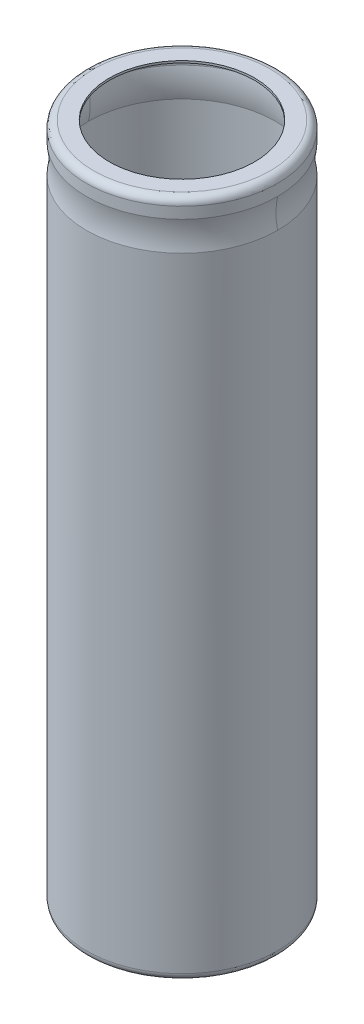
ISO-10303-21;
HEADER;
FILE_DESCRIPTION(('STEP AP214'),'2;1');
FILE_NAME('part.step','',(''),(''),'','','');
FILE_SCHEMA(('AUTOMOTIVE_DESIGN { 1 0 10303 214 1 1 1 1 }'));
ENDSEC;
DATA;
#1=APPLICATION_CONTEXT('core data for automotive mechanical design processes');
#2=APPLICATION_PROTOCOL_DEFINITION('international standard','automotive_design',2000,#1);
#3=PRODUCT_CONTEXT('',#1,'mechanical');
#4=PRODUCT('Part','Part','',(#3));
#5=PRODUCT_RELATED_PRODUCT_CATEGORY('part','',(#4));
#6=PRODUCT_DEFINITION_FORMATION('','',#4);
#7=PRODUCT_DEFINITION_CONTEXT('part definition',#1,'design');
#8=PRODUCT_DEFINITION('design','',#6,#7);
#9=PRODUCT_DEFINITION_SHAPE('','',#8);
#10=(LENGTH_UNIT() NAMED_UNIT(*) SI_UNIT(.MILLI.,.METRE.));
#11=(NAMED_UNIT(*) PLANE_ANGLE_UNIT() SI_UNIT($,.RADIAN.));
#12=(NAMED_UNIT(*) SI_UNIT($,.STERADIAN.) SOLID_ANGLE_UNIT());
#13=UNCERTAINTY_MEASURE_WITH_UNIT(LENGTH_MEASURE(1.E-05),#10,'distance_accuracy_value','');
#14=(GEOMETRIC_REPRESENTATION_CONTEXT(3) GLOBAL_UNCERTAINTY_ASSIGNED_CONTEXT((#13)) GLOBAL_UNIT_ASSIGNED_CONTEXT((#10,
#11,#12)) REPRESENTATION_CONTEXT('',''));
#15=CARTESIAN_POINT('',(0.,0.,0.));
#16=DIRECTION('',(0.,0.,1.));
#17=DIRECTION('',(1.,0.,0.));
#18=AXIS2_PLACEMENT_3D('',#15,#16,#17);
#19=CARTESIAN_POINT('',(0.,-2.74002086044368,0.));
#20=DIRECTION('',(0.,-1.,0.));
#21=DIRECTION('',(0.,0.,-1.));
#22=AXIS2_PLACEMENT_3D('',#19,#20,#21);
#23=CYLINDRICAL_SURFACE('',#22,9.);
#24=CARTESIAN_POINT('',(0.,63.4156994506804,0.));
#25=DIRECTION('',(0.,1.,0.));
#26=DIRECTION('',(0.,0.,1.));
#27=AXIS2_PLACEMENT_3D('',#24,#25,#26);
#28=CIRCLE('',#27,9.);
#29=CARTESIAN_POINT('',(-9.,63.4156994506804,0.));
#30=VERTEX_POINT('',#29);
#31=CARTESIAN_POINT('',(9.,63.4156994506804,0.));
#32=VERTEX_POINT('',#31);
#33=EDGE_CURVE('E94',#30,#32,#28,.T.);
#34=ORIENTED_EDGE('',*,*,#33,.F.);
#35=CARTESIAN_POINT('',(0.,63.4156994506804,0.));
#36=DIRECTION('',(0.,1.,0.));
#37=DIRECTION('',(0.,0.,1.));
#38=AXIS2_PLACEMENT_3D('',#35,#36,#37);
#39=CIRCLE('',#38,9.);
#40=EDGE_CURVE('E83',#32,#30,#39,.T.);
#41=ORIENTED_EDGE('',*,*,#40,.F.);
#42=EDGE_LOOP('',(#34,#41));
#43=FACE_BOUND('',#42,.T.);
#44=CARTESIAN_POINT('',(0.,64.5,0.));
#45=DIRECTION('',(0.,-1.,0.));
#46=DIRECTION('',(0.,0.,-1.));
#47=AXIS2_PLACEMENT_3D('',#44,#45,#46);
#48=CIRCLE('',#47,9.);
#49=CARTESIAN_POINT('',(0.,64.5,-9.));
#50=VERTEX_POINT('',#49);
#51=EDGE_CURVE('E111',#50,#50,#48,.F.);
#52=ORIENTED_EDGE('',*,*,#51,.T.);
#53=EDGE_LOOP('',(#52));
#54=FACE_BOUND('',#53,.T.);
#55=ADVANCED_FACE('F25',(#43,#54),#23,.F.);
#56=CARTESIAN_POINT('',(-9.,63.4156994506804,0.));
#57=CARTESIAN_POINT('',(-9.,63.4156994506804,-18.));
#58=CARTESIAN_POINT('',(8.99999999999999,63.4156994506804,-18.));
#59=CARTESIAN_POINT('',(9.,63.4156994506804,0.));
#60=CARTESIAN_POINT('',(-8.69708004539645,61.9442997310854,0.));
#61=CARTESIAN_POINT('',(-8.69708004539646,61.9442997310854,-17.3941600907929));
#62=CARTESIAN_POINT('',(8.69708004539645,61.9442997310854,-17.3941600907929));
#63=CARTESIAN_POINT('',(8.69708004539645,61.9442997310854,0.));
#64=CARTESIAN_POINT('',(-9.,60.5872723259342,0.));
#65=CARTESIAN_POINT('',(-9.,60.5872723259342,-18.));
#66=CARTESIAN_POINT('',(8.99999999999999,60.5872723259342,-18.));
#67=CARTESIAN_POINT('',(9.,60.5872723259342,0.));
#68=(BOUNDED_SURFACE() B_SPLINE_SURFACE(2,3,((#56,#57,#58,#59),(#60,#61,#62,#63),(#64,#65,#66,
#67)),.UNSPECIFIED.,.F.,.F.,.F.) B_SPLINE_SURFACE_WITH_KNOTS((3,3),(4,4),(0.,0.58752757892576),
(0.,1.),.UNSPECIFIED.) GEOMETRIC_REPRESENTATION_ITEM() RATIONAL_B_SPLINE_SURFACE(((1.,
0.333333333333333,0.333333333333333,1.),(1.,0.333333333333333,0.333333333333333,1.),(1.,
0.333333333333333,0.333333333333333,1.))) REPRESENTATION_ITEM('') SURFACE());
#69=CARTESIAN_POINT('',(9.,63.4156994506804,0.));
#70=CARTESIAN_POINT('',(8.69708004539645,61.9442997310854,0.));
#71=CARTESIAN_POINT('',(9.,60.5872723259342,0.));
#72=B_SPLINE_CURVE_WITH_KNOTS('',2,(#69,#70,#71),.UNSPECIFIED.,.F.,.F.,(3,3),(0.,
0.58752757892576),.UNSPECIFIED.);
#73=CARTESIAN_POINT('',(9.,60.5872723259342,0.));
#74=VERTEX_POINT('',#73);
#75=EDGE_CURVE('E91',#32,#74,#72,.T.);
#76=CARTESIAN_POINT('',(-9.,63.4156994506804,0.));
#77=CARTESIAN_POINT('',(-8.69708004539645,61.9442997310854,0.));
#78=CARTESIAN_POINT('',(-9.,60.5872723259342,0.));
#79=B_SPLINE_CURVE_WITH_KNOTS('',2,(#76,#77,#78),.UNSPECIFIED.,.F.,.F.,(3,3),(0.,
0.58752757892576),.UNSPECIFIED.);
#80=CARTESIAN_POINT('',(-9.,60.5872723259342,0.));
#81=VERTEX_POINT('',#80);
#82=EDGE_CURVE('E89',#81,#30,#79,.F.);
#83=CARTESIAN_POINT('',(0.,60.5872723259342,0.));
#84=DIRECTION('',(0.,-1.,0.));
#85=DIRECTION('',(0.,0.,-1.));
#86=AXIS2_PLACEMENT_3D('',#83,#84,#85);
#87=CIRCLE('',#86,9.);
#88=EDGE_CURVE('E116',#81,#74,#87,.T.);
#89=ORIENTED_EDGE('',*,*,#75,.F.);
#90=ORIENTED_EDGE('',*,*,#40,.T.);
#91=ORIENTED_EDGE('',*,*,#82,.F.);
#92=ORIENTED_EDGE('',*,*,#88,.T.);
#93=EDGE_LOOP('',(#89,#90,#91,#92));
#94=FACE_BOUND('',#93,.T.);
#95=ADVANCED_FACE('F87',(#94),#68,.T.);
#96=CARTESIAN_POINT('',(9.,63.4156994506804,0.));
#97=CARTESIAN_POINT('',(9.,63.4156994506804,18.));
#98=CARTESIAN_POINT('',(-9.,63.4156994506804,18.));
#99=CARTESIAN_POINT('',(-9.,63.4156994506804,0.));
#100=CARTESIAN_POINT('',(8.69708004539645,61.9442997310854,0.));
#101=CARTESIAN_POINT('',(8.69708004539646,61.9442997310854,17.3941600907929));
#102=CARTESIAN_POINT('',(-8.69708004539645,61.9442997310854,17.3941600907929));
#103=CARTESIAN_POINT('',(-8.69708004539645,61.9442997310854,0.));
#104=CARTESIAN_POINT('',(9.,60.5872723259342,0.));
#105=CARTESIAN_POINT('',(9.,60.5872723259342,18.));
#106=CARTESIAN_POINT('',(-9.,60.5872723259342,18.));
#107=CARTESIAN_POINT('',(-9.,60.5872723259342,0.));
#108=(BOUNDED_SURFACE() B_SPLINE_SURFACE(2,3,((#96,#97,#98,#99),(#100,#101,#102,#103),(#104,
#105,#106,#107)),.UNSPECIFIED.,.F.,.F.,.F.) B_SPLINE_SURFACE_WITH_KNOTS((3,3),(4,4),(0.,
0.58752757892576),(0.,1.),
.UNSPECIFIED.) GEOMETRIC_REPRESENTATION_ITEM() RATIONAL_B_SPLINE_SURFACE(((1.,0.333333333333333,
0.333333333333333,1.),(1.,0.333333333333333,0.333333333333333,1.),(1.,0.333333333333333,
0.333333333333333,1.))) REPRESENTATION_ITEM('') SURFACE());
#109=CARTESIAN_POINT('',(0.,60.5872723259342,0.));
#110=DIRECTION('',(0.,-1.,0.));
#111=DIRECTION('',(0.,0.,-1.));
#112=AXIS2_PLACEMENT_3D('',#109,#110,#111);
#113=CIRCLE('',#112,9.);
#114=EDGE_CURVE('E101',#74,#81,#113,.T.);
#115=ORIENTED_EDGE('',*,*,#114,.T.);
#116=ORIENTED_EDGE('',*,*,#82,.T.);
#117=ORIENTED_EDGE('',*,*,#33,.T.);
#118=ORIENTED_EDGE('',*,*,#75,.T.);
#119=EDGE_LOOP('',(#115,#116,#117,#118));
#120=FACE_BOUND('',#119,.T.);
#121=ADVANCED_FACE('F99',(#120),#108,.T.);
#122=CARTESIAN_POINT('',(0.,64.5,0.));
#123=DIRECTION('',(0.,-1.,0.));
#124=DIRECTION('',(0.,0.,-1.));
#125=AXIS2_PLACEMENT_3D('',#122,#123,#124);
#126=TOROIDAL_SURFACE('',#125,8.49851411169271,0.501485888307285);
#127=ORIENTED_EDGE('',*,*,#51,.F.);
#128=EDGE_LOOP('',(#127));
#129=FACE_BOUND('',#128,.T.);
#130=CARTESIAN_POINT('',(0.,65.0014804499123,0.));
#131=DIRECTION('',(0.,1.,0.));
#132=DIRECTION('',(0.,0.,-1.));
#133=AXIS2_PLACEMENT_3D('',#130,#131,#132);
#134=CIRCLE('',#133,8.49617861879794);
#135=CARTESIAN_POINT('',(0.,65.0014815375913,8.49617861879799));
#136=VERTEX_POINT('',#135);
#137=CARTESIAN_POINT('',(0.,65.0014815375913,-8.49617861879799));
#138=VERTEX_POINT('',#137);
#139=EDGE_CURVE('E264',#136,#138,#134,.F.);
#140=ORIENTED_EDGE('',*,*,#139,.F.);
#141=CARTESIAN_POINT('',(0.,65.0014804499123,0.));
#142=DIRECTION('',(0.,1.,0.));
#143=DIRECTION('',(0.,0.,1.));
#144=AXIS2_PLACEMENT_3D('',#141,#142,#143);
#145=CIRCLE('',#144,8.49617861879794);
#146=EDGE_CURVE('E261',#138,#136,#145,.F.);
#147=ORIENTED_EDGE('',*,*,#146,.F.);
#148=EDGE_LOOP('',(#140,#147));
#149=FACE_BOUND('',#148,.T.);
#150=ADVANCED_FACE('F263',(#129,#149),#126,.F.);
#151=CARTESIAN_POINT('',(0.,-2.74002086044368,0.));
#152=DIRECTION('',(0.,-1.,0.));
#153=DIRECTION('',(0.,0.,-1.));
#154=AXIS2_PLACEMENT_3D('',#151,#152,#153);
#155=CYLINDRICAL_SURFACE('',#154,9.);
#156=ORIENTED_EDGE('',*,*,#88,.F.);
#157=ORIENTED_EDGE('',*,*,#114,.F.);
#158=EDGE_LOOP('',(#156,#157));
#159=FACE_BOUND('',#158,.T.);
#160=CARTESIAN_POINT('',(0.,0.5,0.));
#161=DIRECTION('',(0.,-1.,0.));
#162=DIRECTION('',(0.,0.,-1.));
#163=AXIS2_PLACEMENT_3D('',#160,#161,#162);
#164=CIRCLE('',#163,9.);
#165=CARTESIAN_POINT('',(0.,0.5,-9.));
#166=VERTEX_POINT('',#165);
#167=EDGE_CURVE('E142',#166,#166,#164,.T.);
#168=ORIENTED_EDGE('',*,*,#167,.T.);
#169=EDGE_LOOP('',(#168));
#170=FACE_BOUND('',#169,.T.);
#171=ADVANCED_FACE('F289',(#159,#170),#155,.F.);
#172=CARTESIAN_POINT('',(7.,65.0014831691098,0.));
#173=DIRECTION('',(0.,-1.,0.));
#174=DIRECTION('',(0.,0.,-1.));
#175=AXIS2_PLACEMENT_3D('',#172,#173,#174);
#176=PLANE('',#175);
#177=CARTESIAN_POINT('',(0.,65.0014831691098,0.));
#178=DIRECTION('',(0.,-1.,0.));
#179=DIRECTION('',(0.,0.,-1.));
#180=AXIS2_PLACEMENT_3D('',#177,#178,#179);
#181=CIRCLE('',#180,7.);
#182=CARTESIAN_POINT('',(0.,65.0014831691098,-7.));
#183=VERTEX_POINT('',#182);
#184=EDGE_CURVE('E139',#183,#183,#181,.F.);
#185=ORIENTED_EDGE('',*,*,#184,.T.);
#186=EDGE_LOOP('',(#185));
#187=FACE_BOUND('',#186,.T.);
#188=ORIENTED_EDGE('',*,*,#146,.T.);
#189=ORIENTED_EDGE('',*,*,#139,.T.);
#190=EDGE_LOOP('',(#188,#189));
#191=FACE_BOUND('',#190,.T.);
#192=ADVANCED_FACE('F269',(#187,#191),#176,.T.);
#193=CARTESIAN_POINT('',(0.,0.5,0.));
#194=DIRECTION('',(0.,-1.,0.));
#195=DIRECTION('',(0.,0.,-1.));
#196=AXIS2_PLACEMENT_3D('',#193,#194,#195);
#197=TOROIDAL_SURFACE('',#196,8.5,0.5);
#198=ORIENTED_EDGE('',*,*,#167,.F.);
#199=EDGE_LOOP('',(#198));
#200=FACE_BOUND('',#199,.T.);
#201=CARTESIAN_POINT('',(0.,0.00916013452848495,0.));
#202=DIRECTION('',(0.,1.,0.));
#203=DIRECTION('',(0.,0.,1.));
#204=AXIS2_PLACEMENT_3D('',#201,#202,#203);
#205=CIRCLE('',#204,8.59526923146486);
#206=CARTESIAN_POINT('',(0.,0.00916013452848495,8.59526923146486));
#207=VERTEX_POINT('',#206);
#208=EDGE_CURVE('E138',#207,#207,#205,.F.);
#209=ORIENTED_EDGE('',*,*,#208,.T.);
#210=EDGE_LOOP('',(#209));
#211=FACE_BOUND('',#210,.T.);
#212=ADVANCED_FACE('F288',(#200,#211),#197,.F.);
#213=CARTESIAN_POINT('',(0.,-2.74002086044368,0.));
#214=DIRECTION('',(0.,-1.,0.));
#215=DIRECTION('',(0.,0.,-1.));
#216=AXIS2_PLACEMENT_3D('',#213,#214,#215);
#217=CYLINDRICAL_SURFACE('',#216,7.);
#218=ORIENTED_EDGE('',*,*,#184,.F.);
#219=EDGE_LOOP('',(#218));
#220=FACE_BOUND('',#219,.T.);
#221=CARTESIAN_POINT('',(0.,65.2014858883073,0.));
#222=DIRECTION('',(0.,-1.,0.));
#223=DIRECTION('',(0.,0.,-1.));
#224=AXIS2_PLACEMENT_3D('',#221,#222,#223);
#225=CIRCLE('',#224,7.);
#226=CARTESIAN_POINT('',(0.,65.2014858883073,-7.));
#227=VERTEX_POINT('',#226);
#228=EDGE_CURVE('E135',#227,#227,#225,.T.);
#229=ORIENTED_EDGE('',*,*,#228,.F.);
#230=EDGE_LOOP('',(#229));
#231=FACE_BOUND('',#230,.T.);
#232=ADVANCED_FACE('F329',(#220,#231),#217,.F.);
#233=CARTESIAN_POINT('',(0.,0.00916013452848495,0.));
#234=DIRECTION('',(0.,1.,0.));
#235=DIRECTION('',(0.,0.,1.));
#236=AXIS2_PLACEMENT_3D('',#233,#234,#235);
#237=CONICAL_SURFACE('',#236,8.59526923146486,1.47722153041464);
#238=CARTESIAN_POINT('',(0.,0.,0.));
#239=DIRECTION('',(0.,1.,0.));
#240=DIRECTION('',(0.,0.,1.));
#241=AXIS2_PLACEMENT_3D('',#238,#239,#240);
#242=CIRCLE('',#241,8.49766407343343);
#243=CARTESIAN_POINT('',(0.,0.,8.49766407343343));
#244=VERTEX_POINT('',#243);
#245=EDGE_CURVE('E131',#244,#244,#242,.T.);
#246=ORIENTED_EDGE('',*,*,#245,.F.);
#247=EDGE_LOOP('',(#246));
#248=FACE_BOUND('',#247,.T.);
#249=ORIENTED_EDGE('',*,*,#208,.F.);
#250=EDGE_LOOP('',(#249));
#251=FACE_BOUND('',#250,.T.);
#252=ADVANCED_FACE('F400',(#248,#251),#237,.F.);
#253=CARTESIAN_POINT('',(7.,65.2014858883073,0.));
#254=DIRECTION('',(0.,1.,0.));
#255=DIRECTION('',(0.,0.,1.));
#256=AXIS2_PLACEMENT_3D('',#253,#254,#255);
#257=PLANE('',#256);
#258=CARTESIAN_POINT('',(0.,65.2014858883073,0.));
#259=DIRECTION('',(0.,-1.,0.));
#260=DIRECTION('',(0.,0.,-1.));
#261=AXIS2_PLACEMENT_3D('',#258,#259,#260);
#262=CIRCLE('',#261,8.49851411169271);
#263=CARTESIAN_POINT('',(0.,65.2014858883073,-8.49851411169271));
#264=VERTEX_POINT('',#263);
#265=CARTESIAN_POINT('',(0.,65.2014858883073,8.49851411169271));
#266=VERTEX_POINT('',#265);
#267=EDGE_CURVE('E134',#264,#266,#262,.T.);
#268=ORIENTED_EDGE('',*,*,#267,.F.);
#269=CARTESIAN_POINT('',(0.,65.2014858883073,0.));
#270=DIRECTION('',(0.,-1.,0.));
#271=DIRECTION('',(0.,0.,1.));
#272=AXIS2_PLACEMENT_3D('',#269,#270,#271);
#273=CIRCLE('',#272,8.4985141116927);
#274=EDGE_CURVE('E130',#266,#264,#273,.T.);
#275=ORIENTED_EDGE('',*,*,#274,.F.);
#276=EDGE_LOOP('',(#268,#275));
#277=FACE_BOUND('',#276,.T.);
#278=ORIENTED_EDGE('',*,*,#228,.T.);
#279=EDGE_LOOP('',(#278));
#280=FACE_BOUND('',#279,.T.);
#281=ADVANCED_FACE('F393',(#277,#280),#257,.T.);
#282=CARTESIAN_POINT('',(8.49766407343343,0.,0.));
#283=DIRECTION('',(0.,1.,0.));
#284=DIRECTION('',(0.,0.,1.));
#285=AXIS2_PLACEMENT_3D('',#282,#283,#284);
#286=PLANE('',#285);
#287=ORIENTED_EDGE('',*,*,#245,.T.);
#288=EDGE_LOOP('',(#287));
#289=FACE_BOUND('',#288,.T.);
#290=CARTESIAN_POINT('',(0.,0.,0.));
#291=DIRECTION('',(0.,-1.,0.));
#292=DIRECTION('',(0.,0.,-1.));
#293=AXIS2_PLACEMENT_3D('',#290,#291,#292);
#294=CIRCLE('',#293,7.);
#295=CARTESIAN_POINT('',(0.,0.,-7.));
#296=VERTEX_POINT('',#295);
#297=EDGE_CURVE('E127',#296,#296,#294,.T.);
#298=ORIENTED_EDGE('',*,*,#297,.T.);
#299=EDGE_LOOP('',(#298));
#300=FACE_BOUND('',#299,.T.);
#301=ADVANCED_FACE('F243',(#289,#300),#286,.T.);
#302=CARTESIAN_POINT('',(0.,64.5,0.));
#303=DIRECTION('',(0.,-1.,0.));
#304=DIRECTION('',(0.,0.,-1.));
#305=AXIS2_PLACEMENT_3D('',#302,#303,#304);
#306=TOROIDAL_SURFACE('',#305,8.4985141116927,0.701485888307297);
#307=ORIENTED_EDGE('',*,*,#267,.T.);
#308=ORIENTED_EDGE('',*,*,#274,.T.);
#309=EDGE_LOOP('',(#307,#308));
#310=FACE_BOUND('',#309,.T.);
#311=CARTESIAN_POINT('',(0.,64.5,0.));
#312=DIRECTION('',(0.,-1.,0.));
#313=DIRECTION('',(0.,0.,-1.));
#314=AXIS2_PLACEMENT_3D('',#311,#312,#313);
#315=CIRCLE('',#314,9.2);
#316=CARTESIAN_POINT('',(0.,64.5,-9.2));
#317=VERTEX_POINT('',#316);
#318=EDGE_CURVE('E126',#317,#317,#315,.T.);
#319=ORIENTED_EDGE('',*,*,#318,.F.);
#320=EDGE_LOOP('',(#319));
#321=FACE_BOUND('',#320,.T.);
#322=ADVANCED_FACE('F238',(#310,#321),#306,.T.);
#323=CARTESIAN_POINT('',(0.,-2.74002086044368,0.));
#324=DIRECTION('',(0.,-1.,0.));
#325=DIRECTION('',(0.,0.,-1.));
#326=AXIS2_PLACEMENT_3D('',#323,#324,#325);
#327=CYLINDRICAL_SURFACE('',#326,7.);
#328=CARTESIAN_POINT('',(0.,-0.2,0.));
#329=DIRECTION('',(0.,-1.,0.));
#330=DIRECTION('',(0.,0.,-1.));
#331=AXIS2_PLACEMENT_3D('',#328,#329,#330);
#332=CIRCLE('',#331,7.);
#333=CARTESIAN_POINT('',(0.,-0.2,-7.));
#334=VERTEX_POINT('',#333);
#335=EDGE_CURVE('E122',#334,#334,#332,.F.);
#336=ORIENTED_EDGE('',*,*,#335,.F.);
#337=EDGE_LOOP('',(#336));
#338=FACE_BOUND('',#337,.T.);
#339=ORIENTED_EDGE('',*,*,#297,.F.);
#340=EDGE_LOOP('',(#339));
#341=FACE_BOUND('',#340,.T.);
#342=ADVANCED_FACE('F242',(#338,#341),#327,.F.);
#343=CARTESIAN_POINT('',(0.,-2.74002086044368,0.));
#344=DIRECTION('',(0.,-1.,0.));
#345=DIRECTION('',(0.,0.,-1.));
#346=AXIS2_PLACEMENT_3D('',#343,#344,#345);
#347=CYLINDRICAL_SURFACE('',#346,9.2);
#348=ORIENTED_EDGE('',*,*,#318,.T.);
#349=EDGE_LOOP('',(#348));
#350=FACE_BOUND('',#349,.T.);
#351=CARTESIAN_POINT('',(0.,63.4163137820636,0.));
#352=DIRECTION('',(0.,-1.,0.));
#353=DIRECTION('',(0.,0.,-1.));
#354=AXIS2_PLACEMENT_3D('',#351,#352,#353);
#355=CIRCLE('',#354,9.2);
#356=CARTESIAN_POINT('',(-9.2,63.4163137820636,0.));
#357=VERTEX_POINT('',#356);
#358=CARTESIAN_POINT('',(9.2,63.4163137820636,0.));
#359=VERTEX_POINT('',#358);
#360=EDGE_CURVE('E190',#357,#359,#355,.T.);
#361=ORIENTED_EDGE('',*,*,#360,.F.);
#362=CARTESIAN_POINT('',(0.,63.4163137820636,0.));
#363=DIRECTION('',(0.,-1.,0.));
#364=DIRECTION('',(0.,0.,-1.));
#365=AXIS2_PLACEMENT_3D('',#362,#363,#364);
#366=CIRCLE('',#365,9.2);
#367=EDGE_CURVE('E175',#359,#357,#366,.T.);
#368=ORIENTED_EDGE('',*,*,#367,.F.);
#369=EDGE_LOOP('',(#361,#368));
#370=FACE_BOUND('',#369,.T.);
#371=ADVANCED_FACE('F212',(#350,#370),#347,.T.);
#372=CARTESIAN_POINT('',(7.,-0.2,0.));
#373=DIRECTION('',(0.,-1.,0.));
#374=DIRECTION('',(0.,0.,-1.));
#375=AXIS2_PLACEMENT_3D('',#372,#373,#374);
#376=PLANE('',#375);
#377=ORIENTED_EDGE('',*,*,#335,.T.);
#378=EDGE_LOOP('',(#377));
#379=FACE_BOUND('',#378,.T.);
#380=CARTESIAN_POINT('',(0.,-0.200000000000001,0.));
#381=DIRECTION('',(0.,1.,0.));
#382=DIRECTION('',(0.,0.,1.));
#383=AXIS2_PLACEMENT_3D('',#380,#381,#382);
#384=CIRCLE('',#383,8.5);
#385=CARTESIAN_POINT('',(0.,-0.2,8.5));
#386=VERTEX_POINT('',#385);
#387=CARTESIAN_POINT('',(0.,-0.2,-8.5));
#388=VERTEX_POINT('',#387);
#389=EDGE_CURVE('E178',#386,#388,#384,.T.);
#390=ORIENTED_EDGE('',*,*,#389,.F.);
#391=CARTESIAN_POINT('',(0.,-0.200000000000001,0.));
#392=DIRECTION('',(0.,1.,0.));
#393=DIRECTION('',(0.,0.,-1.));
#394=AXIS2_PLACEMENT_3D('',#391,#392,#393);
#395=CIRCLE('',#394,8.5);
#396=EDGE_CURVE('E125',#388,#386,#395,.T.);
#397=ORIENTED_EDGE('',*,*,#396,.F.);
#398=EDGE_LOOP('',(#390,#397));
#399=FACE_BOUND('',#398,.T.);
#400=ADVANCED_FACE('F202',(#379,#399),#376,.T.);
#401=CARTESIAN_POINT('',(-9.2,60.5872723259342,0.));
#402=CARTESIAN_POINT('',(-9.2,60.5872723259342,-18.4));
#403=CARTESIAN_POINT('',(9.2,60.5872723259342,-18.4));
#404=CARTESIAN_POINT('',(9.2,60.5872723259342,0.));
#405=CARTESIAN_POINT('',(-8.90139296490241,61.9539474149841,0.));
#406=CARTESIAN_POINT('',(-8.90139296490242,61.9539474149841,-17.8027859298048));
#407=CARTESIAN_POINT('',(8.90139296490241,61.9539474149841,-17.8027859298048));
#408=CARTESIAN_POINT('',(8.90139296490241,61.9539474149841,0.));
#409=CARTESIAN_POINT('',(-9.2,63.4163137820636,0.));
#410=CARTESIAN_POINT('',(-9.2,63.4163137820636,-18.4));
#411=CARTESIAN_POINT('',(9.2,63.4163137820636,-18.4));
#412=CARTESIAN_POINT('',(9.2,63.4163137820636,0.));
#413=(BOUNDED_SURFACE() B_SPLINE_SURFACE(2,3,((#401,#402,#403,#404),(#405,#406,#407,#408),(#409,
#410,#411,#412)),.UNSPECIFIED.,.F.,.F.,.F.) B_SPLINE_SURFACE_WITH_KNOTS((3,3),(4,4),(0.,
0.679954534493778),(0.,1.),
.UNSPECIFIED.) GEOMETRIC_REPRESENTATION_ITEM() RATIONAL_B_SPLINE_SURFACE(((1.,0.333333333333333,
0.333333333333333,1.),(1.,0.333333333333333,0.333333333333333,1.),(1.,0.333333333333333,
0.333333333333333,1.))) REPRESENTATION_ITEM('') SURFACE());
#414=CARTESIAN_POINT('',(9.2,60.5872723259342,0.));
#415=CARTESIAN_POINT('',(8.90139296490241,61.9539474149841,0.));
#416=CARTESIAN_POINT('',(9.2,63.4163137820636,0.));
#417=B_SPLINE_CURVE_WITH_KNOTS('',2,(#414,#415,#416),.UNSPECIFIED.,.F.,.F.,(3,3),(0.,
0.679954534493778),.UNSPECIFIED.);
#418=CARTESIAN_POINT('',(9.2,60.5872723259342,0.));
#419=VERTEX_POINT('',#418);
#420=EDGE_CURVE('E45',#419,#359,#417,.T.);
#421=CARTESIAN_POINT('',(0.,60.5872723259342,0.));
#422=DIRECTION('',(0.,-1.,0.));
#423=DIRECTION('',(0.,0.,-1.));
#424=AXIS2_PLACEMENT_3D('',#421,#422,#423);
#425=CIRCLE('',#424,9.2);
#426=CARTESIAN_POINT('',(-9.2,60.5872723259342,0.));
#427=VERTEX_POINT('',#426);
#428=EDGE_CURVE('E173',#427,#419,#425,.T.);
#429=CARTESIAN_POINT('',(-9.2,60.5872723259342,0.));
#430=CARTESIAN_POINT('',(-8.90139296490241,61.9539474149841,0.));
#431=CARTESIAN_POINT('',(-9.2,63.4163137820636,0.));
#432=B_SPLINE_CURVE_WITH_KNOTS('',2,(#429,#430,#431),.UNSPECIFIED.,.F.,.F.,(3,3),(0.,
0.679954534493778),.UNSPECIFIED.);
#433=EDGE_CURVE('E182',#357,#427,#432,.F.);
#434=ORIENTED_EDGE('',*,*,#420,.F.);
#435=ORIENTED_EDGE('',*,*,#428,.F.);
#436=ORIENTED_EDGE('',*,*,#433,.F.);
#437=ORIENTED_EDGE('',*,*,#360,.T.);
#438=EDGE_LOOP('',(#434,#435,#436,#437));
#439=FACE_BOUND('',#438,.T.);
#440=ADVANCED_FACE('F211',(#439),#413,.T.);
#441=CARTESIAN_POINT('',(9.2,60.5872723259342,0.));
#442=CARTESIAN_POINT('',(9.2,60.5872723259342,18.4));
#443=CARTESIAN_POINT('',(-9.2,60.5872723259342,18.4));
#444=CARTESIAN_POINT('',(-9.2,60.5872723259342,0.));
#445=CARTESIAN_POINT('',(8.90139296490241,61.9539474149841,0.));
#446=CARTESIAN_POINT('',(8.90139296490241,61.9539474149841,17.8027859298048));
#447=CARTESIAN_POINT('',(-8.90139296490241,61.9539474149841,17.8027859298048));
#448=CARTESIAN_POINT('',(-8.90139296490241,61.9539474149841,0.));
#449=CARTESIAN_POINT('',(9.2,63.4163137820636,0.));
#450=CARTESIAN_POINT('',(9.2,63.4163137820636,18.4));
#451=CARTESIAN_POINT('',(-9.2,63.4163137820636,18.4));
#452=CARTESIAN_POINT('',(-9.2,63.4163137820636,0.));
#453=(BOUNDED_SURFACE() B_SPLINE_SURFACE(2,3,((#441,#442,#443,#444),(#445,#446,#447,#448),(#449,
#450,#451,#452)),.UNSPECIFIED.,.F.,.F.,.F.) B_SPLINE_SURFACE_WITH_KNOTS((3,3),(4,4),(0.,
0.679954534493778),(0.,1.),
.UNSPECIFIED.) GEOMETRIC_REPRESENTATION_ITEM() RATIONAL_B_SPLINE_SURFACE(((1.,0.333333333333333,
0.333333333333333,1.),(1.,0.333333333333333,0.333333333333333,1.),(1.,0.333333333333333,
0.333333333333333,1.))) REPRESENTATION_ITEM('') SURFACE());
#454=CARTESIAN_POINT('',(0.,60.5872723259342,0.));
#455=DIRECTION('',(0.,-1.,0.));
#456=DIRECTION('',(0.,0.,-1.));
#457=AXIS2_PLACEMENT_3D('',#454,#455,#456);
#458=CIRCLE('',#457,9.2);
#459=EDGE_CURVE('E36',#419,#427,#458,.T.);
#460=ORIENTED_EDGE('',*,*,#420,.T.);
#461=ORIENTED_EDGE('',*,*,#367,.T.);
#462=ORIENTED_EDGE('',*,*,#433,.T.);
#463=ORIENTED_EDGE('',*,*,#459,.F.);
#464=EDGE_LOOP('',(#460,#461,#462,#463));
#465=FACE_BOUND('',#464,.T.);
#466=ADVANCED_FACE('F164',(#465),#453,.T.);
#467=CARTESIAN_POINT('',(0.,0.5,0.));
#468=DIRECTION('',(0.,-1.,0.));
#469=DIRECTION('',(0.,0.,-1.));
#470=AXIS2_PLACEMENT_3D('',#467,#468,#469);
#471=TOROIDAL_SURFACE('',#470,8.5,0.700000000000001);
#472=ORIENTED_EDGE('',*,*,#396,.T.);
#473=ORIENTED_EDGE('',*,*,#389,.T.);
#474=EDGE_LOOP('',(#472,#473));
#475=FACE_BOUND('',#474,.T.);
#476=CARTESIAN_POINT('',(0.,0.5,0.));
#477=DIRECTION('',(0.,-1.,0.));
#478=DIRECTION('',(0.,0.,-1.));
#479=AXIS2_PLACEMENT_3D('',#476,#477,#478);
#480=CIRCLE('',#479,9.2);
#481=CARTESIAN_POINT('',(0.,0.5,-9.2));
#482=VERTEX_POINT('',#481);
#483=EDGE_CURVE('E13',#482,#482,#480,.F.);
#484=ORIENTED_EDGE('',*,*,#483,.F.);
#485=EDGE_LOOP('',(#484));
#486=FACE_BOUND('',#485,.T.);
#487=ADVANCED_FACE('F152',(#475,#486),#471,.T.);
#488=CARTESIAN_POINT('',(0.,-2.74002086044368,0.));
#489=DIRECTION('',(0.,-1.,0.));
#490=DIRECTION('',(0.,0.,-1.));
#491=AXIS2_PLACEMENT_3D('',#488,#489,#490);
#492=CYLINDRICAL_SURFACE('',#491,9.2);
#493=ORIENTED_EDGE('',*,*,#483,.T.);
#494=EDGE_LOOP('',(#493));
#495=FACE_BOUND('',#494,.T.);
#496=ORIENTED_EDGE('',*,*,#459,.T.);
#497=ORIENTED_EDGE('',*,*,#428,.T.);
#498=EDGE_LOOP('',(#496,#497));
#499=FACE_BOUND('',#498,.T.);
#500=ADVANCED_FACE('F163',(#495,#499),#492,.T.);
#501=CLOSED_SHELL('',(#55,#95,#121,#150,#171,#192,#212,#232,#252,#281,#301,#322,#342,#371,#400,
#440,#466,#487,#500));
#502=MANIFOLD_SOLID_BREP('B1',#501);
#503=ADVANCED_BREP_SHAPE_REPRESENTATION('',(#18,#502),#14);
#504=SHAPE_DEFINITION_REPRESENTATION(#9,#503);
ENDSEC;
END-ISO-10303-21;
